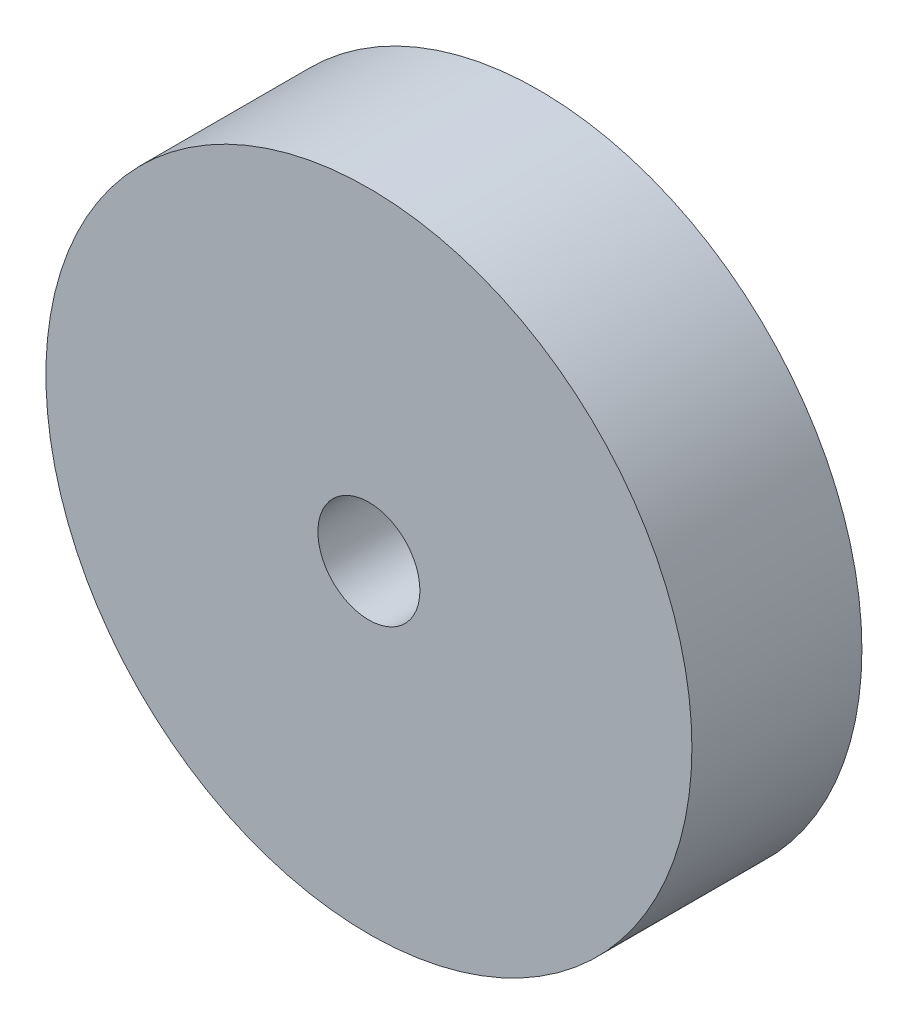
ISO-10303-21;
HEADER;
FILE_DESCRIPTION(('STEP AP214'),'2;1');
FILE_NAME('part.step','',(''),(''),'','','');
FILE_SCHEMA(('AUTOMOTIVE_DESIGN { 1 0 10303 214 1 1 1 1 }'));
ENDSEC;
DATA;
#1=APPLICATION_CONTEXT('core data for automotive mechanical design processes');
#2=APPLICATION_PROTOCOL_DEFINITION('international standard','automotive_design',2000,#1);
#3=PRODUCT_CONTEXT('',#1,'mechanical');
#4=PRODUCT('Part','Part','',(#3));
#5=PRODUCT_RELATED_PRODUCT_CATEGORY('part','',(#4));
#6=PRODUCT_DEFINITION_FORMATION('','',#4);
#7=PRODUCT_DEFINITION_CONTEXT('part definition',#1,'design');
#8=PRODUCT_DEFINITION('design','',#6,#7);
#9=PRODUCT_DEFINITION_SHAPE('','',#8);
#10=(LENGTH_UNIT() NAMED_UNIT(*) SI_UNIT(.MILLI.,.METRE.));
#11=(NAMED_UNIT(*) PLANE_ANGLE_UNIT() SI_UNIT($,.RADIAN.));
#12=(NAMED_UNIT(*) SI_UNIT($,.STERADIAN.) SOLID_ANGLE_UNIT());
#13=UNCERTAINTY_MEASURE_WITH_UNIT(LENGTH_MEASURE(1.E-05),#10,'distance_accuracy_value','');
#14=(GEOMETRIC_REPRESENTATION_CONTEXT(3) GLOBAL_UNCERTAINTY_ASSIGNED_CONTEXT((#13)) GLOBAL_UNIT_ASSIGNED_CONTEXT((#10,
#11,#12)) REPRESENTATION_CONTEXT('',''));
#15=CARTESIAN_POINT('',(0.,0.,0.));
#16=DIRECTION('',(0.,0.,1.));
#17=DIRECTION('',(1.,0.,0.));
#18=AXIS2_PLACEMENT_3D('',#15,#16,#17);
#19=CARTESIAN_POINT('',(0.,0.,10.));
#20=DIRECTION('',(0.,0.,-1.));
#21=DIRECTION('',(-1.,0.,0.));
#22=AXIS2_PLACEMENT_3D('',#19,#20,#21);
#23=CYLINDRICAL_SURFACE('',#22,19.);
#24=CARTESIAN_POINT('',(0.,0.,10.));
#25=DIRECTION('',(0.,0.,1.));
#26=DIRECTION('',(1.,0.,0.));
#27=AXIS2_PLACEMENT_3D('',#24,#25,#26);
#28=CIRCLE('',#27,19.);
#29=CARTESIAN_POINT('',(19.,0.,10.));
#30=VERTEX_POINT('',#29);
#31=EDGE_CURVE('E10',#30,#30,#28,.T.);
#32=ORIENTED_EDGE('',*,*,#31,.F.);
#33=EDGE_LOOP('',(#32));
#34=FACE_BOUND('',#33,.T.);
#35=CARTESIAN_POINT('',(0.,0.,0.));
#36=DIRECTION('',(0.,0.,1.));
#37=DIRECTION('',(1.,0.,0.));
#38=AXIS2_PLACEMENT_3D('',#35,#36,#37);
#39=CIRCLE('',#38,19.);
#40=CARTESIAN_POINT('',(19.,0.,0.));
#41=VERTEX_POINT('',#40);
#42=EDGE_CURVE('E44',#41,#41,#39,.T.);
#43=ORIENTED_EDGE('',*,*,#42,.T.);
#44=EDGE_LOOP('',(#43));
#45=FACE_BOUND('',#44,.T.);
#46=ADVANCED_FACE('F41',(#34,#45),#23,.T.);
#47=CARTESIAN_POINT('',(0.,0.,10.));
#48=DIRECTION('',(0.,0.,1.));
#49=DIRECTION('',(1.,0.,0.));
#50=AXIS2_PLACEMENT_3D('',#47,#48,#49);
#51=PLANE('',#50);
#52=CARTESIAN_POINT('',(0.,0.,10.));
#53=DIRECTION('',(0.,0.,1.));
#54=DIRECTION('',(1.,0.,0.));
#55=AXIS2_PLACEMENT_3D('',#52,#53,#54);
#56=CIRCLE('',#55,3.);
#57=CARTESIAN_POINT('',(3.,0.,10.));
#58=VERTEX_POINT('',#57);
#59=EDGE_CURVE('E53',#58,#58,#56,.T.);
#60=ORIENTED_EDGE('',*,*,#59,.F.);
#61=EDGE_LOOP('',(#60));
#62=FACE_BOUND('',#61,.T.);
#63=ORIENTED_EDGE('',*,*,#31,.T.);
#64=EDGE_LOOP('',(#63));
#65=FACE_BOUND('',#64,.T.);
#66=ADVANCED_FACE('F68',(#62,#65),#51,.T.);
#67=CARTESIAN_POINT('',(0.,0.,0.));
#68=DIRECTION('',(0.,0.,1.));
#69=DIRECTION('',(1.,0.,0.));
#70=AXIS2_PLACEMENT_3D('',#67,#68,#69);
#71=PLANE('',#70);
#72=CARTESIAN_POINT('',(0.,0.,0.));
#73=DIRECTION('',(0.,0.,1.));
#74=DIRECTION('',(1.,0.,0.));
#75=AXIS2_PLACEMENT_3D('',#72,#73,#74);
#76=CIRCLE('',#75,3.);
#77=CARTESIAN_POINT('',(3.,0.,0.));
#78=VERTEX_POINT('',#77);
#79=EDGE_CURVE('E51',#78,#78,#76,.T.);
#80=ORIENTED_EDGE('',*,*,#79,.T.);
#81=EDGE_LOOP('',(#80));
#82=FACE_BOUND('',#81,.T.);
#83=ORIENTED_EDGE('',*,*,#42,.F.);
#84=EDGE_LOOP('',(#83));
#85=FACE_BOUND('',#84,.T.);
#86=ADVANCED_FACE('F59',(#82,#85),#71,.F.);
#87=CARTESIAN_POINT('',(0.,0.,0.));
#88=DIRECTION('',(0.,0.,1.));
#89=DIRECTION('',(1.,0.,0.));
#90=AXIS2_PLACEMENT_3D('',#87,#88,#89);
#91=CYLINDRICAL_SURFACE('',#90,3.);
#92=ORIENTED_EDGE('',*,*,#79,.F.);
#93=EDGE_LOOP('',(#92));
#94=FACE_BOUND('',#93,.T.);
#95=ORIENTED_EDGE('',*,*,#59,.T.);
#96=EDGE_LOOP('',(#95));
#97=FACE_BOUND('',#96,.T.);
#98=ADVANCED_FACE('F62',(#94,#97),#91,.F.);
#99=CLOSED_SHELL('',(#46,#66,#86,#98));
#100=MANIFOLD_SOLID_BREP('B2',#99);
#101=ADVANCED_BREP_SHAPE_REPRESENTATION('',(#18,#100),#14);
#102=SHAPE_DEFINITION_REPRESENTATION(#9,#101);
ENDSEC;
END-ISO-10303-21;
